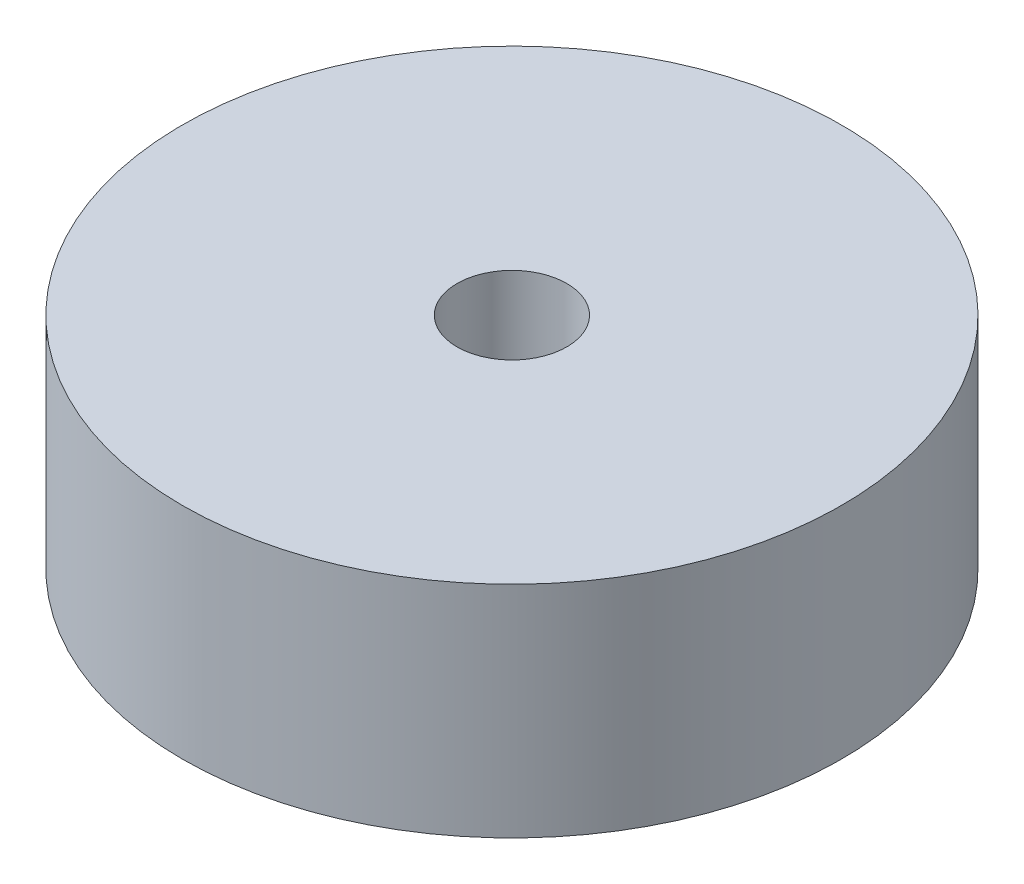
ISO-10303-21;
HEADER;
FILE_DESCRIPTION(('STEP AP214'),'2;1');
FILE_NAME('part.step','',(''),(''),'','','');
FILE_SCHEMA(('AUTOMOTIVE_DESIGN { 1 0 10303 214 1 1 1 1 }'));
ENDSEC;
DATA;
#1=APPLICATION_CONTEXT('core data for automotive mechanical design processes');
#2=APPLICATION_PROTOCOL_DEFINITION('international standard','automotive_design',2000,#1);
#3=PRODUCT_CONTEXT('',#1,'mechanical');
#4=PRODUCT('Part','Part','',(#3));
#5=PRODUCT_RELATED_PRODUCT_CATEGORY('part','',(#4));
#6=PRODUCT_DEFINITION_FORMATION('','',#4);
#7=PRODUCT_DEFINITION_CONTEXT('part definition',#1,'design');
#8=PRODUCT_DEFINITION('design','',#6,#7);
#9=PRODUCT_DEFINITION_SHAPE('','',#8);
#10=(LENGTH_UNIT() NAMED_UNIT(*) SI_UNIT(.MILLI.,.METRE.));
#11=(NAMED_UNIT(*) PLANE_ANGLE_UNIT() SI_UNIT($,.RADIAN.));
#12=(NAMED_UNIT(*) SI_UNIT($,.STERADIAN.) SOLID_ANGLE_UNIT());
#13=UNCERTAINTY_MEASURE_WITH_UNIT(LENGTH_MEASURE(1.E-05),#10,'distance_accuracy_value','');
#14=(GEOMETRIC_REPRESENTATION_CONTEXT(3) GLOBAL_UNCERTAINTY_ASSIGNED_CONTEXT((#13)) GLOBAL_UNIT_ASSIGNED_CONTEXT((#10,
#11,#12)) REPRESENTATION_CONTEXT('',''));
#15=CARTESIAN_POINT('',(0.,0.,0.));
#16=DIRECTION('',(0.,0.,1.));
#17=DIRECTION('',(1.,0.,0.));
#18=AXIS2_PLACEMENT_3D('',#15,#16,#17);
#19=CARTESIAN_POINT('',(0.,12.7,0.));
#20=DIRECTION('',(0.,-1.,0.));
#21=DIRECTION('',(0.,0.,-1.));
#22=AXIS2_PLACEMENT_3D('',#19,#20,#21);
#23=CYLINDRICAL_SURFACE('',#22,19.05);
#24=CARTESIAN_POINT('',(0.,12.7,0.));
#25=DIRECTION('',(0.,1.,0.));
#26=DIRECTION('',(0.,0.,1.));
#27=AXIS2_PLACEMENT_3D('',#24,#25,#26);
#28=CIRCLE('',#27,19.05);
#29=CARTESIAN_POINT('',(0.,12.7,19.05));
#30=VERTEX_POINT('',#29);
#31=EDGE_CURVE('E10',#30,#30,#28,.T.);
#32=ORIENTED_EDGE('',*,*,#31,.F.);
#33=EDGE_LOOP('',(#32));
#34=FACE_BOUND('',#33,.T.);
#35=CARTESIAN_POINT('',(0.,0.,0.));
#36=DIRECTION('',(0.,1.,0.));
#37=DIRECTION('',(0.,0.,1.));
#38=AXIS2_PLACEMENT_3D('',#35,#36,#37);
#39=CIRCLE('',#38,19.05);
#40=CARTESIAN_POINT('',(0.,0.,19.05));
#41=VERTEX_POINT('',#40);
#42=EDGE_CURVE('E36',#41,#41,#39,.T.);
#43=ORIENTED_EDGE('',*,*,#42,.T.);
#44=EDGE_LOOP('',(#43));
#45=FACE_BOUND('',#44,.T.);
#46=ADVANCED_FACE('F33',(#34,#45),#23,.T.);
#47=CARTESIAN_POINT('',(0.,12.7,0.));
#48=DIRECTION('',(0.,1.,0.));
#49=DIRECTION('',(0.,0.,1.));
#50=AXIS2_PLACEMENT_3D('',#47,#48,#49);
#51=PLANE('',#50);
#52=CARTESIAN_POINT('',(0.,12.7,0.));
#53=DIRECTION('',(0.,1.,0.));
#54=DIRECTION('',(0.,0.,1.));
#55=AXIS2_PLACEMENT_3D('',#52,#53,#54);
#56=CIRCLE('',#55,3.175);
#57=CARTESIAN_POINT('',(0.,12.7,3.175));
#58=VERTEX_POINT('',#57);
#59=EDGE_CURVE('E45',#58,#58,#56,.T.);
#60=ORIENTED_EDGE('',*,*,#59,.F.);
#61=EDGE_LOOP('',(#60));
#62=FACE_BOUND('',#61,.T.);
#63=ORIENTED_EDGE('',*,*,#31,.T.);
#64=EDGE_LOOP('',(#63));
#65=FACE_BOUND('',#64,.T.);
#66=ADVANCED_FACE('F60',(#62,#65),#51,.T.);
#67=CARTESIAN_POINT('',(0.,0.,0.));
#68=DIRECTION('',(0.,1.,0.));
#69=DIRECTION('',(0.,0.,1.));
#70=AXIS2_PLACEMENT_3D('',#67,#68,#69);
#71=PLANE('',#70);
#72=CARTESIAN_POINT('',(0.,0.,0.));
#73=DIRECTION('',(0.,1.,0.));
#74=DIRECTION('',(0.,0.,1.));
#75=AXIS2_PLACEMENT_3D('',#72,#73,#74);
#76=CIRCLE('',#75,3.175);
#77=CARTESIAN_POINT('',(0.,0.,3.175));
#78=VERTEX_POINT('',#77);
#79=EDGE_CURVE('E43',#78,#78,#76,.T.);
#80=ORIENTED_EDGE('',*,*,#79,.T.);
#81=EDGE_LOOP('',(#80));
#82=FACE_BOUND('',#81,.T.);
#83=ORIENTED_EDGE('',*,*,#42,.F.);
#84=EDGE_LOOP('',(#83));
#85=FACE_BOUND('',#84,.T.);
#86=ADVANCED_FACE('F51',(#82,#85),#71,.F.);
#87=CARTESIAN_POINT('',(0.,0.,0.));
#88=DIRECTION('',(0.,1.,0.));
#89=DIRECTION('',(0.,0.,1.));
#90=AXIS2_PLACEMENT_3D('',#87,#88,#89);
#91=CYLINDRICAL_SURFACE('',#90,3.175);
#92=ORIENTED_EDGE('',*,*,#79,.F.);
#93=EDGE_LOOP('',(#92));
#94=FACE_BOUND('',#93,.T.);
#95=ORIENTED_EDGE('',*,*,#59,.T.);
#96=EDGE_LOOP('',(#95));
#97=FACE_BOUND('',#96,.T.);
#98=ADVANCED_FACE('F54',(#94,#97),#91,.F.);
#99=CLOSED_SHELL('',(#46,#66,#86,#98));
#100=MANIFOLD_SOLID_BREP('B2',#99);
#101=ADVANCED_BREP_SHAPE_REPRESENTATION('',(#18,#100),#14);
#102=SHAPE_DEFINITION_REPRESENTATION(#9,#101);
ENDSEC;
END-ISO-10303-21;
